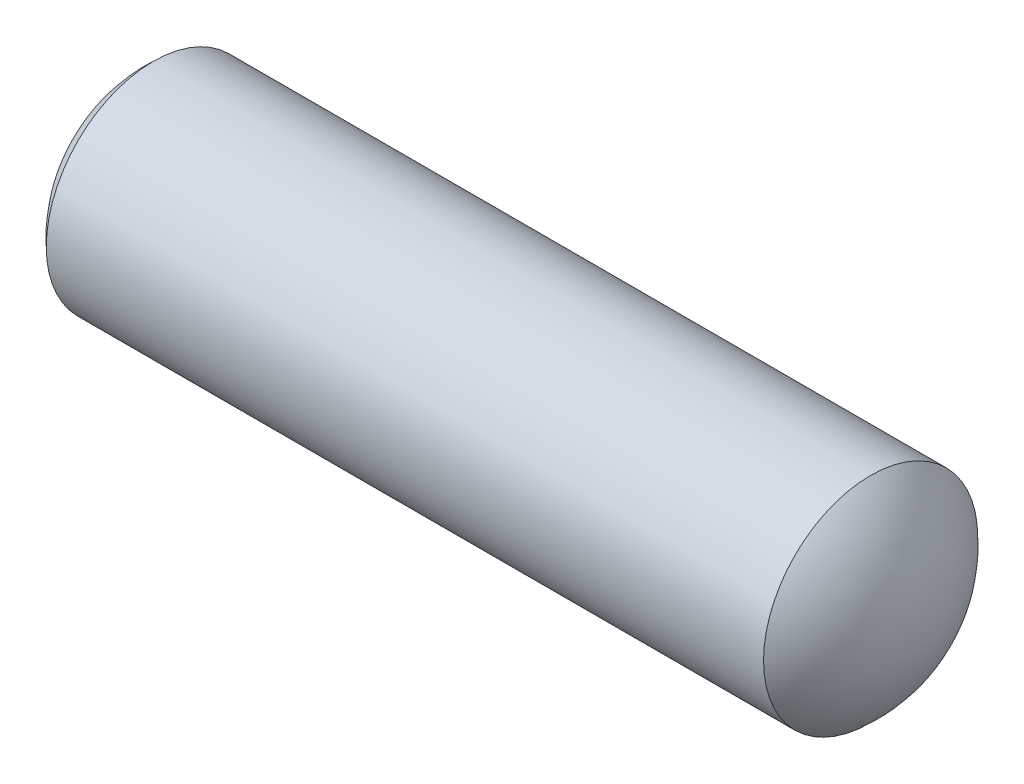
ISO-10303-21;
HEADER;
FILE_DESCRIPTION(('STEP AP214'),'2;1');
FILE_NAME('part.step','',(''),(''),'','','');
FILE_SCHEMA(('AUTOMOTIVE_DESIGN { 1 0 10303 214 1 1 1 1 }'));
ENDSEC;
DATA;
#1=APPLICATION_CONTEXT('core data for automotive mechanical design processes');
#2=APPLICATION_PROTOCOL_DEFINITION('international standard','automotive_design',2000,#1);
#3=PRODUCT_CONTEXT('',#1,'mechanical');
#4=PRODUCT('Part','Part','',(#3));
#5=PRODUCT_RELATED_PRODUCT_CATEGORY('part','',(#4));
#6=PRODUCT_DEFINITION_FORMATION('','',#4);
#7=PRODUCT_DEFINITION_CONTEXT('part definition',#1,'design');
#8=PRODUCT_DEFINITION('design','',#6,#7);
#9=PRODUCT_DEFINITION_SHAPE('','',#8);
#10=(LENGTH_UNIT() NAMED_UNIT(*) SI_UNIT(.MILLI.,.METRE.));
#11=(NAMED_UNIT(*) PLANE_ANGLE_UNIT() SI_UNIT($,.RADIAN.));
#12=(NAMED_UNIT(*) SI_UNIT($,.STERADIAN.) SOLID_ANGLE_UNIT());
#13=UNCERTAINTY_MEASURE_WITH_UNIT(LENGTH_MEASURE(1.E-05),#10,'distance_accuracy_value','');
#14=(GEOMETRIC_REPRESENTATION_CONTEXT(3) GLOBAL_UNCERTAINTY_ASSIGNED_CONTEXT((#13)) GLOBAL_UNIT_ASSIGNED_CONTEXT((#10,
#11,#12)) REPRESENTATION_CONTEXT('',''));
#15=CARTESIAN_POINT('',(0.,0.,0.));
#16=DIRECTION('',(0.,0.,1.));
#17=DIRECTION('',(1.,0.,0.));
#18=AXIS2_PLACEMENT_3D('',#15,#16,#17);
#19=CARTESIAN_POINT('',(-7.4,0.,0.));
#20=DIRECTION('',(-1.,0.,0.));
#21=DIRECTION('',(0.,1.,0.));
#22=AXIS2_PLACEMENT_3D('',#19,#20,#21);
#23=SPHERICAL_SURFACE('',#22,4.);
#24=CARTESIAN_POINT('',(-10.0457513110646,0.,0.));
#25=DIRECTION('',(-1.,0.,0.));
#26=DIRECTION('',(0.,0.,1.));
#27=AXIS2_PLACEMENT_3D('',#24,#25,#26);
#28=CIRCLE('',#27,3.);
#29=CARTESIAN_POINT('',(-10.0457513110646,0.,3.));
#30=VERTEX_POINT('',#29);
#31=EDGE_CURVE('E354',#30,#30,#28,.T.);
#32=ORIENTED_EDGE('',*,*,#31,.T.);
#33=EDGE_LOOP('',(#32));
#34=FACE_BOUND('',#33,.T.);
#35=ADVANCED_FACE('F348',(#34),#23,.T.);
#36=CARTESIAN_POINT('',(7.4,0.,0.));
#37=DIRECTION('',(-1.,0.,0.));
#38=DIRECTION('',(0.,1.,0.));
#39=AXIS2_PLACEMENT_3D('',#36,#37,#38);
#40=SPHERICAL_SURFACE('',#39,4.);
#41=CARTESIAN_POINT('',(10.0457513110646,0.,0.));
#42=DIRECTION('',(-1.,0.,0.));
#43=DIRECTION('',(0.,0.,1.));
#44=AXIS2_PLACEMENT_3D('',#41,#42,#43);
#45=CIRCLE('',#44,3.);
#46=CARTESIAN_POINT('',(10.0457513110646,0.,3.));
#47=VERTEX_POINT('',#46);
#48=EDGE_CURVE('E10',#47,#47,#45,.T.);
#49=ORIENTED_EDGE('',*,*,#48,.F.);
#50=EDGE_LOOP('',(#49));
#51=FACE_BOUND('',#50,.T.);
#52=ADVANCED_FACE('F363',(#51),#40,.T.);
#53=CARTESIAN_POINT('',(-27.28976,0.,0.));
#54=DIRECTION('',(-1.,0.,0.));
#55=DIRECTION('',(0.,0.,1.));
#56=AXIS2_PLACEMENT_3D('',#53,#54,#55);
#57=CYLINDRICAL_SURFACE('',#56,3.);
#58=ORIENTED_EDGE('',*,*,#31,.F.);
#59=EDGE_LOOP('',(#58));
#60=FACE_BOUND('',#59,.T.);
#61=ORIENTED_EDGE('',*,*,#48,.T.);
#62=EDGE_LOOP('',(#61));
#63=FACE_BOUND('',#62,.T.);
#64=ADVANCED_FACE('F361',(#60,#63),#57,.T.);
#65=CLOSED_SHELL('',(#35,#52,#64));
#66=MANIFOLD_SOLID_BREP('B2',#65);
#67=ADVANCED_BREP_SHAPE_REPRESENTATION('',(#18,#66),#14);
#68=SHAPE_DEFINITION_REPRESENTATION(#9,#67);
ENDSEC;
END-ISO-10303-21;
